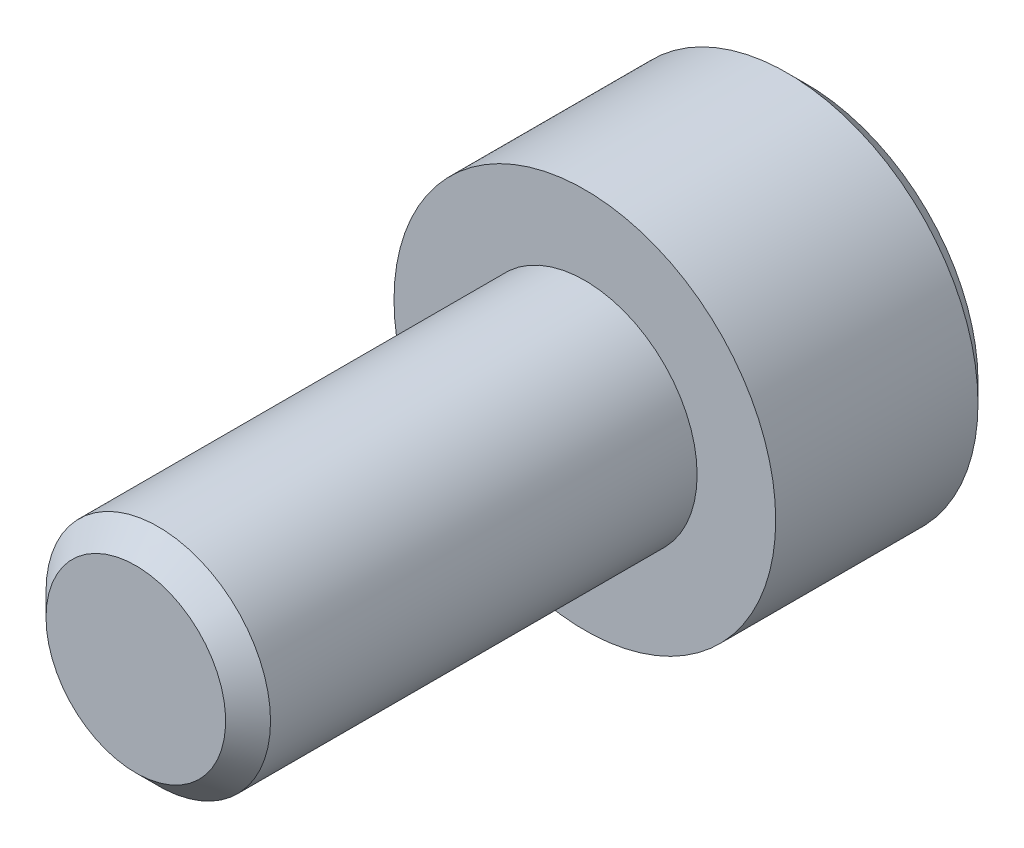
ISO-10303-21;
HEADER;
FILE_DESCRIPTION(('STEP AP214'),'2;1');
FILE_NAME('part.step','',(''),(''),'','','');
FILE_SCHEMA(('AUTOMOTIVE_DESIGN { 1 0 10303 214 1 1 1 1 }'));
ENDSEC;
DATA;
#1=APPLICATION_CONTEXT('core data for automotive mechanical design processes');
#2=APPLICATION_PROTOCOL_DEFINITION('international standard','automotive_design',2000,#1);
#3=PRODUCT_CONTEXT('',#1,'mechanical');
#4=PRODUCT('Part','Part','',(#3));
#5=PRODUCT_RELATED_PRODUCT_CATEGORY('part','',(#4));
#6=PRODUCT_DEFINITION_FORMATION('','',#4);
#7=PRODUCT_DEFINITION_CONTEXT('part definition',#1,'design');
#8=PRODUCT_DEFINITION('design','',#6,#7);
#9=PRODUCT_DEFINITION_SHAPE('','',#8);
#10=(LENGTH_UNIT() NAMED_UNIT(*) SI_UNIT(.MILLI.,.METRE.));
#11=(NAMED_UNIT(*) PLANE_ANGLE_UNIT() SI_UNIT($,.RADIAN.));
#12=(NAMED_UNIT(*) SI_UNIT($,.STERADIAN.) SOLID_ANGLE_UNIT());
#13=UNCERTAINTY_MEASURE_WITH_UNIT(LENGTH_MEASURE(1.E-05),#10,'distance_accuracy_value','');
#14=(GEOMETRIC_REPRESENTATION_CONTEXT(3) GLOBAL_UNCERTAINTY_ASSIGNED_CONTEXT((#13)) GLOBAL_UNIT_ASSIGNED_CONTEXT((#10,
#11,#12)) REPRESENTATION_CONTEXT('',''));
#15=CARTESIAN_POINT('',(0.,0.,0.));
#16=DIRECTION('',(0.,0.,1.));
#17=DIRECTION('',(1.,0.,0.));
#18=AXIS2_PLACEMENT_3D('',#15,#16,#17);
#19=CARTESIAN_POINT('',(0.,0.,-2.43));
#20=DIRECTION('',(0.,0.,1.));
#21=DIRECTION('',(1.,0.,0.));
#22=AXIS2_PLACEMENT_3D('',#19,#20,#21);
#23=PLANE('',#22);
#24=DIRECTION('',(0.,1.,0.));
#25=VECTOR('',#24,1.);
#26=CARTESIAN_POINT('',(2.,1.15470053837925,-2.43));
#27=LINE('',#26,#25);
#28=CARTESIAN_POINT('',(2.,1.15470053837925,-2.43));
#29=VERTEX_POINT('',#28);
#30=CARTESIAN_POINT('',(2.,-1.15470053837925,-2.43));
#31=VERTEX_POINT('',#30);
#32=EDGE_CURVE('E125',#29,#31,#27,.F.);
#33=ORIENTED_EDGE('',*,*,#32,.T.);
#34=DIRECTION('',(0.866025403784439,0.499999999999999,0.));
#35=VECTOR('',#34,1.);
#36=CARTESIAN_POINT('',(2.,-1.15470053837925,-2.43));
#37=LINE('',#36,#35);
#38=CARTESIAN_POINT('',(0.,-2.3094010767585,-2.43));
#39=VERTEX_POINT('',#38);
#40=EDGE_CURVE('E74',#31,#39,#37,.F.);
#41=ORIENTED_EDGE('',*,*,#40,.T.);
#42=DIRECTION('',(0.866025403784438,-0.5,0.));
#43=VECTOR('',#42,1.);
#44=CARTESIAN_POINT('',(0.,-2.3094010767585,-2.43));
#45=LINE('',#44,#43);
#46=CARTESIAN_POINT('',(-2.,-1.15470053837925,-2.43));
#47=VERTEX_POINT('',#46);
#48=EDGE_CURVE('E71',#39,#47,#45,.F.);
#49=ORIENTED_EDGE('',*,*,#48,.T.);
#50=DIRECTION('',(0.,1.,0.));
#51=VECTOR('',#50,1.);
#52=CARTESIAN_POINT('',(-2.,-1.15470053837925,-2.43));
#53=LINE('',#52,#51);
#54=CARTESIAN_POINT('',(-2.,1.15470053837925,-2.43));
#55=VERTEX_POINT('',#54);
#56=EDGE_CURVE('E68',#47,#55,#53,.T.);
#57=ORIENTED_EDGE('',*,*,#56,.T.);
#58=DIRECTION('',(-0.866025403784439,-0.5,0.));
#59=VECTOR('',#58,1.);
#60=CARTESIAN_POINT('',(-2.,1.15470053837925,-2.43));
#61=LINE('',#60,#59);
#62=CARTESIAN_POINT('',(0.,2.3094010767585,-2.43));
#63=VERTEX_POINT('',#62);
#64=EDGE_CURVE('E91',#55,#63,#61,.F.);
#65=ORIENTED_EDGE('',*,*,#64,.T.);
#66=DIRECTION('',(-0.866025403784439,0.5,0.));
#67=VECTOR('',#66,1.);
#68=CARTESIAN_POINT('',(0.,2.3094010767585,-2.43));
#69=LINE('',#68,#67);
#70=EDGE_CURVE('E130',#63,#29,#69,.F.);
#71=ORIENTED_EDGE('',*,*,#70,.T.);
#72=EDGE_LOOP('',(#33,#41,#49,#57,#65,#71));
#73=FACE_BOUND('',#72,.T.);
#74=ADVANCED_FACE('F17',(#73),#23,.F.);
#75=CARTESIAN_POINT('',(0.,-2.3094010767585,-4.93));
#76=DIRECTION('',(-0.5,-0.866025403784438,0.));
#77=DIRECTION('',(0.866025403784438,-0.5,0.));
#78=AXIS2_PLACEMENT_3D('',#75,#76,#77);
#79=PLANE('',#78);
#80=ORIENTED_EDGE('',*,*,#48,.F.);
#81=DIRECTION('',(0.,0.,1.));
#82=VECTOR('',#81,1.);
#83=CARTESIAN_POINT('',(0.,-2.3094010767585,-4.93));
#84=LINE('',#83,#82);
#85=CARTESIAN_POINT('',(0.,-2.3094010767585,-4.93));
#86=VERTEX_POINT('',#85);
#87=EDGE_CURVE('E120',#39,#86,#84,.F.);
#88=ORIENTED_EDGE('',*,*,#87,.T.);
#89=DIRECTION('',(-0.866025403784439,0.5,0.));
#90=VECTOR('',#89,1.);
#91=CARTESIAN_POINT('',(0.,-2.3094010767585,-4.93));
#92=LINE('',#91,#90);
#93=CARTESIAN_POINT('',(-2.,-1.15470053837925,-4.93));
#94=VERTEX_POINT('',#93);
#95=EDGE_CURVE('E82',#86,#94,#92,.T.);
#96=ORIENTED_EDGE('',*,*,#95,.T.);
#97=DIRECTION('',(0.,0.,1.));
#98=VECTOR('',#97,1.);
#99=CARTESIAN_POINT('',(-2.,-1.15470053837925,-4.93));
#100=LINE('',#99,#98);
#101=EDGE_CURVE('E77',#94,#47,#100,.T.);
#102=ORIENTED_EDGE('',*,*,#101,.T.);
#103=EDGE_LOOP('',(#80,#88,#96,#102));
#104=FACE_BOUND('',#103,.T.);
#105=ADVANCED_FACE('F80',(#104),#79,.F.);
#106=CARTESIAN_POINT('',(-2.,-1.15470053837925,-4.93));
#107=DIRECTION('',(-1.,0.,0.));
#108=DIRECTION('',(0.,0.,1.));
#109=AXIS2_PLACEMENT_3D('',#106,#107,#108);
#110=PLANE('',#109);
#111=ORIENTED_EDGE('',*,*,#56,.F.);
#112=ORIENTED_EDGE('',*,*,#101,.F.);
#113=DIRECTION('',(0.,1.,0.));
#114=VECTOR('',#113,1.);
#115=CARTESIAN_POINT('',(-2.,0.,-4.93));
#116=LINE('',#115,#114);
#117=CARTESIAN_POINT('',(-2.,1.15470053837925,-4.93));
#118=VERTEX_POINT('',#117);
#119=EDGE_CURVE('E117',#94,#118,#116,.T.);
#120=ORIENTED_EDGE('',*,*,#119,.T.);
#121=DIRECTION('',(0.,0.,1.));
#122=VECTOR('',#121,1.);
#123=CARTESIAN_POINT('',(-2.,1.15470053837925,-4.93));
#124=LINE('',#123,#122);
#125=EDGE_CURVE('E88',#118,#55,#124,.T.);
#126=ORIENTED_EDGE('',*,*,#125,.T.);
#127=EDGE_LOOP('',(#111,#112,#120,#126));
#128=FACE_BOUND('',#127,.T.);
#129=ADVANCED_FACE('F86',(#128),#110,.F.);
#130=CARTESIAN_POINT('',(-2.,1.15470053837925,-4.93));
#131=DIRECTION('',(-0.5,0.866025403784439,0.));
#132=DIRECTION('',(-0.866025403784439,-0.5,0.));
#133=AXIS2_PLACEMENT_3D('',#130,#131,#132);
#134=PLANE('',#133);
#135=ORIENTED_EDGE('',*,*,#64,.F.);
#136=ORIENTED_EDGE('',*,*,#125,.F.);
#137=DIRECTION('',(0.866025403784439,0.499999999999999,0.));
#138=VECTOR('',#137,1.);
#139=CARTESIAN_POINT('',(-2.,1.15470053837925,-4.93));
#140=LINE('',#139,#138);
#141=CARTESIAN_POINT('',(0.,2.3094010767585,-4.93));
#142=VERTEX_POINT('',#141);
#143=EDGE_CURVE('E115',#118,#142,#140,.T.);
#144=ORIENTED_EDGE('',*,*,#143,.T.);
#145=DIRECTION('',(0.,0.,1.));
#146=VECTOR('',#145,1.);
#147=CARTESIAN_POINT('',(0.,2.3094010767585,-4.93));
#148=LINE('',#147,#146);
#149=EDGE_CURVE('E132',#142,#63,#148,.T.);
#150=ORIENTED_EDGE('',*,*,#149,.T.);
#151=EDGE_LOOP('',(#135,#136,#144,#150));
#152=FACE_BOUND('',#151,.T.);
#153=ADVANCED_FACE('F137',(#152),#134,.F.);
#154=CARTESIAN_POINT('',(0.,2.3094010767585,-4.93));
#155=DIRECTION('',(0.5,0.866025403784439,0.));
#156=DIRECTION('',(-0.866025403784439,0.5,0.));
#157=AXIS2_PLACEMENT_3D('',#154,#155,#156);
#158=PLANE('',#157);
#159=ORIENTED_EDGE('',*,*,#70,.F.);
#160=ORIENTED_EDGE('',*,*,#149,.F.);
#161=DIRECTION('',(0.866025403784439,-0.5,0.));
#162=VECTOR('',#161,1.);
#163=CARTESIAN_POINT('',(0.,2.3094010767585,-4.93));
#164=LINE('',#163,#162);
#165=CARTESIAN_POINT('',(2.,1.15470053837925,-4.93));
#166=VERTEX_POINT('',#165);
#167=EDGE_CURVE('E113',#142,#166,#164,.T.);
#168=ORIENTED_EDGE('',*,*,#167,.T.);
#169=DIRECTION('',(0.,0.,-1.));
#170=VECTOR('',#169,1.);
#171=CARTESIAN_POINT('',(2.,1.15470053837925,-4.93));
#172=LINE('',#171,#170);
#173=EDGE_CURVE('E127',#166,#29,#172,.F.);
#174=ORIENTED_EDGE('',*,*,#173,.T.);
#175=EDGE_LOOP('',(#159,#160,#168,#174));
#176=FACE_BOUND('',#175,.T.);
#177=ADVANCED_FACE('F141',(#176),#158,.F.);
#178=CARTESIAN_POINT('',(2.,1.15470053837925,-4.93));
#179=DIRECTION('',(1.,0.,0.));
#180=DIRECTION('',(0.,0.,-1.));
#181=AXIS2_PLACEMENT_3D('',#178,#179,#180);
#182=PLANE('',#181);
#183=ORIENTED_EDGE('',*,*,#32,.F.);
#184=ORIENTED_EDGE('',*,*,#173,.F.);
#185=DIRECTION('',(0.,1.,0.));
#186=VECTOR('',#185,1.);
#187=CARTESIAN_POINT('',(2.,0.,-4.93));
#188=LINE('',#187,#186);
#189=CARTESIAN_POINT('',(2.,-1.15470053837925,-4.93));
#190=VERTEX_POINT('',#189);
#191=EDGE_CURVE('E35',#166,#190,#188,.F.);
#192=ORIENTED_EDGE('',*,*,#191,.T.);
#193=DIRECTION('',(0.,0.,1.));
#194=VECTOR('',#193,1.);
#195=CARTESIAN_POINT('',(2.,-1.15470053837925,-4.93));
#196=LINE('',#195,#194);
#197=EDGE_CURVE('E123',#190,#31,#196,.T.);
#198=ORIENTED_EDGE('',*,*,#197,.T.);
#199=EDGE_LOOP('',(#183,#184,#192,#198));
#200=FACE_BOUND('',#199,.T.);
#201=ADVANCED_FACE('F143',(#200),#182,.F.);
#202=CARTESIAN_POINT('',(2.,-1.15470053837925,-4.93));
#203=DIRECTION('',(0.499999999999999,-0.866025403784439,0.));
#204=DIRECTION('',(0.866025403784439,0.499999999999999,0.));
#205=AXIS2_PLACEMENT_3D('',#202,#203,#204);
#206=PLANE('',#205);
#207=ORIENTED_EDGE('',*,*,#40,.F.);
#208=ORIENTED_EDGE('',*,*,#197,.F.);
#209=DIRECTION('',(-0.866025403784439,-0.499999999999999,0.));
#210=VECTOR('',#209,1.);
#211=CARTESIAN_POINT('',(2.,-1.15470053837925,-4.93));
#212=LINE('',#211,#210);
#213=EDGE_CURVE('E107',#190,#86,#212,.T.);
#214=ORIENTED_EDGE('',*,*,#213,.T.);
#215=ORIENTED_EDGE('',*,*,#87,.F.);
#216=EDGE_LOOP('',(#207,#208,#214,#215));
#217=FACE_BOUND('',#216,.T.);
#218=ADVANCED_FACE('F146',(#217),#206,.F.);
#219=CARTESIAN_POINT('',(0.,0.,-4.93));
#220=DIRECTION('',(0.,0.,1.));
#221=DIRECTION('',(1.,0.,0.));
#222=AXIS2_PLACEMENT_3D('',#219,#220,#221);
#223=PLANE('',#222);
#224=ORIENTED_EDGE('',*,*,#191,.F.);
#225=ORIENTED_EDGE('',*,*,#167,.F.);
#226=ORIENTED_EDGE('',*,*,#143,.F.);
#227=ORIENTED_EDGE('',*,*,#119,.F.);
#228=ORIENTED_EDGE('',*,*,#95,.F.);
#229=ORIENTED_EDGE('',*,*,#213,.F.);
#230=EDGE_LOOP('',(#224,#225,#226,#227,#228,#229));
#231=FACE_BOUND('',#230,.T.);
#232=CARTESIAN_POINT('',(0.,0.,-4.9300000000585));
#233=DIRECTION('',(0.,0.,1.));
#234=DIRECTION('',(1.,0.,0.));
#235=AXIS2_PLACEMENT_3D('',#232,#233,#234);
#236=CIRCLE('',#235,3.82500000000618);
#237=CARTESIAN_POINT('',(3.82500000000618,0.,-4.9300000000585));
#238=VERTEX_POINT('',#237);
#239=EDGE_CURVE('E20',#238,#238,#236,.T.);
#240=ORIENTED_EDGE('',*,*,#239,.F.);
#241=EDGE_LOOP('',(#240));
#242=FACE_BOUND('',#241,.T.);
#243=ADVANCED_FACE('F148',(#231,#242),#223,.F.);
#244=CARTESIAN_POINT('',(0.,0.,-4.50499999999465));
#245=DIRECTION('',(0.,0.,1.));
#246=DIRECTION('',(1.,0.,0.));
#247=AXIS2_PLACEMENT_3D('',#244,#245,#246);
#248=CONICAL_SURFACE('',#247,4.25000000007003,0.785398163397448);
#249=ORIENTED_EDGE('',*,*,#239,.T.);
#250=EDGE_LOOP('',(#249));
#251=FACE_BOUND('',#250,.T.);
#252=CARTESIAN_POINT('',(0.,0.,-4.505));
#253=DIRECTION('',(0.,0.,1.));
#254=DIRECTION('',(1.,0.,0.));
#255=AXIS2_PLACEMENT_3D('',#252,#253,#254);
#256=CIRCLE('',#255,4.25);
#257=CARTESIAN_POINT('',(4.25,0.,-4.505));
#258=VERTEX_POINT('',#257);
#259=EDGE_CURVE('E99',#258,#258,#256,.T.);
#260=ORIENTED_EDGE('',*,*,#259,.F.);
#261=EDGE_LOOP('',(#260));
#262=FACE_BOUND('',#261,.T.);
#263=ADVANCED_FACE('F151',(#251,#262),#248,.T.);
#264=CARTESIAN_POINT('',(0.,0.,10.));
#265=DIRECTION('',(0.,0.,1.));
#266=DIRECTION('',(1.,0.,0.));
#267=AXIS2_PLACEMENT_3D('',#264,#265,#266);
#268=PLANE('',#267);
#269=CARTESIAN_POINT('',(0.,0.,9.99999999999091));
#270=DIRECTION('',(0.,0.,-1.));
#271=DIRECTION('',(-1.,0.,0.));
#272=AXIS2_PLACEMENT_3D('',#269,#270,#271);
#273=CIRCLE('',#272,1.99999999995271);
#274=CARTESIAN_POINT('',(-1.99999999995271,0.,9.99999999999091));
#275=VERTEX_POINT('',#274);
#276=EDGE_CURVE('E97',#275,#275,#273,.T.);
#277=ORIENTED_EDGE('',*,*,#276,.F.);
#278=EDGE_LOOP('',(#277));
#279=FACE_BOUND('',#278,.T.);
#280=ADVANCED_FACE('F157',(#279),#268,.T.);
#281=CARTESIAN_POINT('',(0.,0.,-4.93));
#282=DIRECTION('',(0.,0.,1.));
#283=DIRECTION('',(1.,0.,0.));
#284=AXIS2_PLACEMENT_3D('',#281,#282,#283);
#285=CYLINDRICAL_SURFACE('',#284,4.25);
#286=ORIENTED_EDGE('',*,*,#259,.T.);
#287=EDGE_LOOP('',(#286));
#288=FACE_BOUND('',#287,.T.);
#289=CARTESIAN_POINT('',(0.,0.,0.));
#290=DIRECTION('',(0.,0.,1.));
#291=DIRECTION('',(1.,0.,0.));
#292=AXIS2_PLACEMENT_3D('',#289,#290,#291);
#293=CIRCLE('',#292,4.25);
#294=CARTESIAN_POINT('',(4.25,0.,0.));
#295=VERTEX_POINT('',#294);
#296=EDGE_CURVE('E95',#295,#295,#293,.T.);
#297=ORIENTED_EDGE('',*,*,#296,.F.);
#298=EDGE_LOOP('',(#297));
#299=FACE_BOUND('',#298,.T.);
#300=ADVANCED_FACE('F163',(#288,#299),#285,.T.);
#301=CARTESIAN_POINT('',(0.,0.,9.49999999988904));
#302=DIRECTION('',(0.,0.,-1.));
#303=DIRECTION('',(-1.,0.,0.));
#304=AXIS2_PLACEMENT_3D('',#301,#302,#303);
#305=CONICAL_SURFACE('',#304,2.50000000005457,0.785398163397448);
#306=CARTESIAN_POINT('',(0.,0.,9.5));
#307=DIRECTION('',(0.,0.,1.));
#308=DIRECTION('',(1.,0.,0.));
#309=AXIS2_PLACEMENT_3D('',#306,#307,#308);
#310=CIRCLE('',#309,2.5);
#311=CARTESIAN_POINT('',(2.5,0.,9.5));
#312=VERTEX_POINT('',#311);
#313=EDGE_CURVE('E26',#312,#312,#310,.F.);
#314=ORIENTED_EDGE('',*,*,#313,.F.);
#315=EDGE_LOOP('',(#314));
#316=FACE_BOUND('',#315,.T.);
#317=ORIENTED_EDGE('',*,*,#276,.T.);
#318=EDGE_LOOP('',(#317));
#319=FACE_BOUND('',#318,.T.);
#320=ADVANCED_FACE('F174',(#316,#319),#305,.T.);
#321=CARTESIAN_POINT('',(0.,0.,0.));
#322=DIRECTION('',(0.,0.,1.));
#323=DIRECTION('',(1.,0.,0.));
#324=AXIS2_PLACEMENT_3D('',#321,#322,#323);
#325=PLANE('',#324);
#326=CARTESIAN_POINT('',(0.,0.,0.));
#327=DIRECTION('',(0.,0.,1.));
#328=DIRECTION('',(1.,0.,0.));
#329=AXIS2_PLACEMENT_3D('',#326,#327,#328);
#330=CIRCLE('',#329,2.5);
#331=CARTESIAN_POINT('',(2.5,0.,0.));
#332=VERTEX_POINT('',#331);
#333=EDGE_CURVE('E11',#332,#332,#330,.T.);
#334=ORIENTED_EDGE('',*,*,#333,.F.);
#335=EDGE_LOOP('',(#334));
#336=FACE_BOUND('',#335,.T.);
#337=ORIENTED_EDGE('',*,*,#296,.T.);
#338=EDGE_LOOP('',(#337));
#339=FACE_BOUND('',#338,.T.);
#340=ADVANCED_FACE('F168',(#336,#339),#325,.T.);
#341=CARTESIAN_POINT('',(0.,0.,0.));
#342=DIRECTION('',(0.,0.,1.));
#343=DIRECTION('',(1.,0.,0.));
#344=AXIS2_PLACEMENT_3D('',#341,#342,#343);
#345=CYLINDRICAL_SURFACE('',#344,2.5);
#346=ORIENTED_EDGE('',*,*,#333,.T.);
#347=EDGE_LOOP('',(#346));
#348=FACE_BOUND('',#347,.T.);
#349=ORIENTED_EDGE('',*,*,#313,.T.);
#350=EDGE_LOOP('',(#349));
#351=FACE_BOUND('',#350,.T.);
#352=ADVANCED_FACE('F166',(#348,#351),#345,.T.);
#353=CLOSED_SHELL('',(#74,#105,#129,#153,#177,#201,#218,#243,#263,#280,#300,#320,#340,#352));
#354=MANIFOLD_SOLID_BREP('B1',#353);
#355=ADVANCED_BREP_SHAPE_REPRESENTATION('',(#18,#354),#14);
#356=SHAPE_DEFINITION_REPRESENTATION(#9,#355);
ENDSEC;
END-ISO-10303-21;
